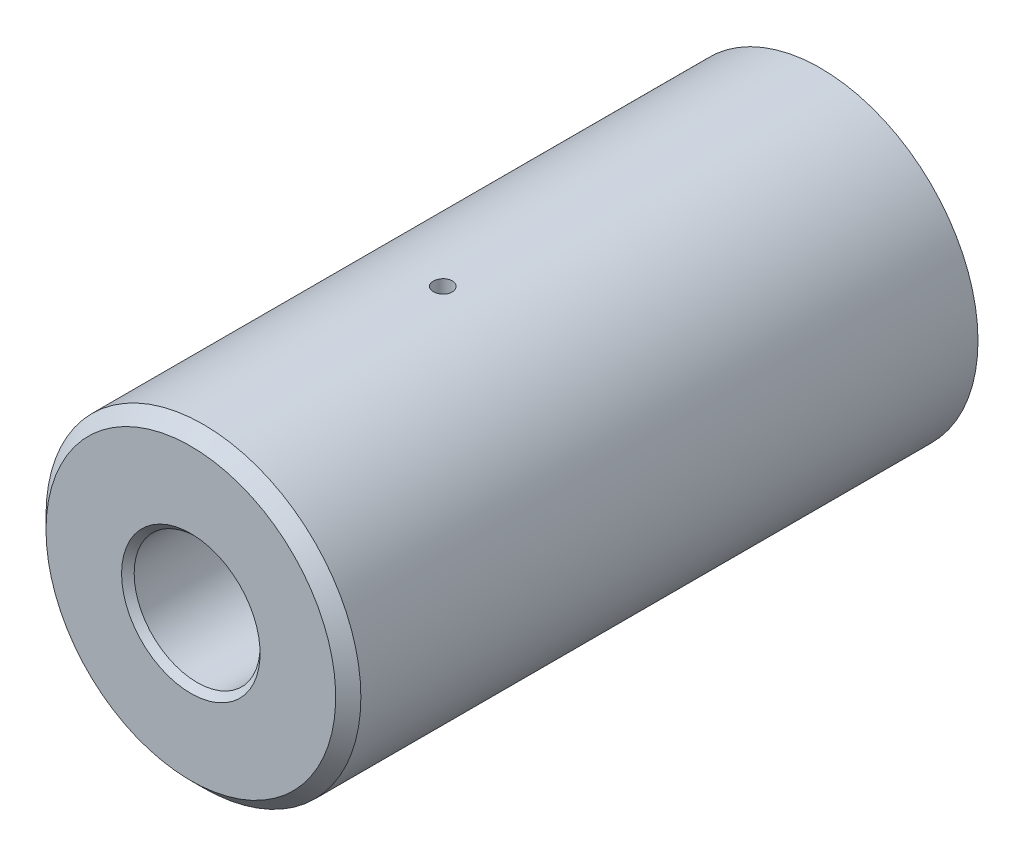
ISO-10303-21;
HEADER;
FILE_DESCRIPTION(('STEP AP214'),'2;1');
FILE_NAME('part.step','',(''),(''),'','','');
FILE_SCHEMA(('AUTOMOTIVE_DESIGN { 1 0 10303 214 1 1 1 1 }'));
ENDSEC;
DATA;
#1=APPLICATION_CONTEXT('core data for automotive mechanical design processes');
#2=APPLICATION_PROTOCOL_DEFINITION('international standard','automotive_design',2000,#1);
#3=PRODUCT_CONTEXT('',#1,'mechanical');
#4=PRODUCT('Part','Part','',(#3));
#5=PRODUCT_RELATED_PRODUCT_CATEGORY('part','',(#4));
#6=PRODUCT_DEFINITION_FORMATION('','',#4);
#7=PRODUCT_DEFINITION_CONTEXT('part definition',#1,'design');
#8=PRODUCT_DEFINITION('design','',#6,#7);
#9=PRODUCT_DEFINITION_SHAPE('','',#8);
#10=(LENGTH_UNIT() NAMED_UNIT(*) SI_UNIT(.MILLI.,.METRE.));
#11=(NAMED_UNIT(*) PLANE_ANGLE_UNIT() SI_UNIT($,.RADIAN.));
#12=(NAMED_UNIT(*) SI_UNIT($,.STERADIAN.) SOLID_ANGLE_UNIT());
#13=UNCERTAINTY_MEASURE_WITH_UNIT(LENGTH_MEASURE(1.E-05),#10,'distance_accuracy_value','');
#14=(GEOMETRIC_REPRESENTATION_CONTEXT(3) GLOBAL_UNCERTAINTY_ASSIGNED_CONTEXT((#13)) GLOBAL_UNIT_ASSIGNED_CONTEXT((#10,
#11,#12)) REPRESENTATION_CONTEXT('',''));
#15=CARTESIAN_POINT('',(0.,0.,0.));
#16=DIRECTION('',(0.,0.,1.));
#17=DIRECTION('',(1.,0.,0.));
#18=AXIS2_PLACEMENT_3D('',#15,#16,#17);
#19=CARTESIAN_POINT('',(0.,0.,20.8371683277006));
#20=DIRECTION('',(0.,0.,-1.));
#21=DIRECTION('',(-1.,0.,0.));
#22=AXIS2_PLACEMENT_3D('',#19,#20,#21);
#23=PLANE('',#22);
#24=CARTESIAN_POINT('',(0.,0.,20.8371683277006));
#25=DIRECTION('',(0.,0.,-1.));
#26=DIRECTION('',(-1.,0.,0.));
#27=AXIS2_PLACEMENT_3D('',#24,#25,#26);
#28=CIRCLE('',#27,13.);
#29=CARTESIAN_POINT('',(-13.,0.,20.8371683277006));
#30=VERTEX_POINT('',#29);
#31=EDGE_CURVE('E63',#30,#30,#28,.T.);
#32=ORIENTED_EDGE('',*,*,#31,.T.);
#33=EDGE_LOOP('',(#32));
#34=FACE_BOUND('',#33,.T.);
#35=CARTESIAN_POINT('',(0.,0.,20.8371683277006));
#36=DIRECTION('',(0.,0.,1.));
#37=DIRECTION('',(1.,0.,0.));
#38=AXIS2_PLACEMENT_3D('',#35,#36,#37);
#39=CIRCLE('',#38,10.);
#40=CARTESIAN_POINT('',(10.,0.,20.8371683277006));
#41=VERTEX_POINT('',#40);
#42=EDGE_CURVE('E191',#41,#41,#39,.T.);
#43=ORIENTED_EDGE('',*,*,#42,.T.);
#44=EDGE_LOOP('',(#43));
#45=FACE_BOUND('',#44,.T.);
#46=ADVANCED_FACE('F45',(#34,#45),#23,.T.);
#47=CARTESIAN_POINT('',(0.,0.,55.3466501870873));
#48=DIRECTION('',(0.,0.,1.));
#49=DIRECTION('',(1.,0.,0.));
#50=AXIS2_PLACEMENT_3D('',#47,#48,#49);
#51=CYLINDRICAL_SURFACE('',#50,15.);
#52=CARTESIAN_POINT('',(0.,15.,4.33716832770063));
#53=CARTESIAN_POINT('',(0.0840305306873422,14.9999990328115,4.3371719665512));
#54=CARTESIAN_POINT('',(0.168116617751665,14.9992863839431,4.3442532310453));
#55=CARTESIAN_POINT('',(0.33395759774526,14.9965120139211,4.37239488313627));
#56=CARTESIAN_POINT('',(0.415709818753246,14.9944488065104,4.39347067173751));
#57=CARTESIAN_POINT('',(0.574457513180125,14.9892062184461,4.44898168859738));
#58=CARTESIAN_POINT('',(0.651455826922367,14.9860275120106,4.48340884847834));
#59=CARTESIAN_POINT('',(0.798564241440612,14.9789093609146,4.5646296895981));
#60=CARTESIAN_POINT('',(0.868675708168616,14.974970067572,4.61142091170084));
#61=CARTESIAN_POINT('',(1.00028932601112,14.9667561651199,4.71622237419404));
#62=CARTESIAN_POINT('',(1.06176321725234,14.962480523608,4.77426802680368));
#63=CARTESIAN_POINT('',(1.17411378214648,14.9540843535939,4.89985512909517));
#64=CARTESIAN_POINT('',(1.22498996562398,14.9499638322738,4.96739701776421));
#65=CARTESIAN_POINT('',(1.31480095566542,14.9423338732918,5.11023612522606));
#66=CARTESIAN_POINT('',(1.35371019818232,14.9388257506636,5.18554949384291));
#67=CARTESIAN_POINT('',(1.41831957711414,14.9328305631979,5.34168170655809));
#68=CARTESIAN_POINT('',(1.44402003988693,14.9303434731333,5.42250041457655));
#69=CARTESIAN_POINT('',(1.48139856240284,14.9266812610947,5.58706102899963));
#70=CARTESIAN_POINT('',(1.49312347950569,14.9255017559714,5.67079219297893));
#71=CARTESIAN_POINT('',(1.50236292770304,14.9245746459079,5.83904162279429));
#72=CARTESIAN_POINT('',(1.4998778323062,14.9248270033312,5.92355986788371));
#73=CARTESIAN_POINT('',(1.48080642037901,14.926731103484,6.0906612922406));
#74=CARTESIAN_POINT('',(1.46427126618683,14.9283777688598,6.17325037669366));
#75=CARTESIAN_POINT('',(1.41764871622588,14.9328770143113,6.33447527250226));
#76=CARTESIAN_POINT('',(1.38756113738362,14.9357296106774,6.41311103043816));
#77=CARTESIAN_POINT('',(1.31463134082226,14.9423251417811,6.56435870864895));
#78=CARTESIAN_POINT('',(1.27176642407997,14.9460696586224,6.63695961193459));
#79=CARTESIAN_POINT('',(1.17451504102984,14.9540257759932,6.77395615006844));
#80=CARTESIAN_POINT('',(1.12012823750476,14.9582373901918,6.83835154467326));
#81=CARTESIAN_POINT('',(1.0010911686181,14.9666757796948,6.95740641868415));
#82=CARTESIAN_POINT('',(0.936396718277046,14.970902539995,7.01202173052182));
#83=CARTESIAN_POINT('',(0.798734222605671,14.9788774361778,7.10962377706619));
#84=CARTESIAN_POINT('',(0.725766167999404,14.9826255715238,7.15261049873533));
#85=CARTESIAN_POINT('',(0.57359715853855,14.9892221350064,7.22573335816599));
#86=CARTESIAN_POINT('',(0.494395119584859,14.9920704062215,7.2558672549277));
#87=CARTESIAN_POINT('',(0.332020825994903,14.9965447116211,7.30239670276824));
#88=CARTESIAN_POINT('',(0.248848690164906,14.998170782356,7.31879266468655));
#89=CARTESIAN_POINT('',(0.0812776486378623,15.0000127750247,7.33732478930276));
#90=CARTESIAN_POINT('',(-0.00311445315823079,15.000234724016,7.33952190007936));
#91=CARTESIAN_POINT('',(-0.171065689973541,14.999259626352,7.32975403312746));
#92=CARTESIAN_POINT('',(-0.254624836230696,14.998062598867,7.31778924672769));
#93=CARTESIAN_POINT('',(-0.418362310252002,14.9943879230879,7.28008778456825));
#94=CARTESIAN_POINT('',(-0.498547273458018,14.9919129287706,7.25437964598359));
#95=CARTESIAN_POINT('',(-0.653466482075661,14.9859599829091,7.18995056664471));
#96=CARTESIAN_POINT('',(-0.728200605235664,14.9824820088788,7.15122933414152));
#97=CARTESIAN_POINT('',(-0.8703722702582,14.9748971299563,7.06172206970474));
#98=CARTESIAN_POINT('',(-0.937784489623362,14.9707881540516,7.01089599431189));
#99=CARTESIAN_POINT('',(-1.0631424349678,14.9624089930428,6.89867922608922));
#100=CARTESIAN_POINT('',(-1.12108792327375,14.9581388038946,6.83728826809514));
#101=CARTESIAN_POINT('',(-1.2260791648307,14.9499003621113,6.70541846571211));
#102=CARTESIAN_POINT('',(-1.2730849180193,14.9459332520846,6.63490769288668));
#103=CARTESIAN_POINT('',(-1.35458738811572,14.9387674869133,6.48695728748059));
#104=CARTESIAN_POINT('',(-1.38908427608081,14.9355688212606,6.40951774966802));
#105=CARTESIAN_POINT('',(-1.4445228130267,14.9303092145107,6.25004521850193));
#106=CARTESIAN_POINT('',(-1.46548826221778,14.9282462767468,6.16802056756394));
#107=CARTESIAN_POINT('',(-1.49334601069418,14.9254854792431,6.00159353075946));
#108=CARTESIAN_POINT('',(-1.50023871359926,14.9247875803528,5.91719121315711));
#109=CARTESIAN_POINT('',(-1.49974970770687,14.9248366966134,5.74880229516556));
#110=CARTESIAN_POINT('',(-1.49243083438965,14.9255773513051,5.6648155033764));
#111=CARTESIAN_POINT('',(-1.46385817944546,14.9284065583432,5.49927095194819));
#112=CARTESIAN_POINT('',(-1.44260438214322,14.9304951122058,5.41771319504165));
#113=CARTESIAN_POINT('',(-1.38678252944624,14.9357830239478,5.25934230412884));
#114=CARTESIAN_POINT('',(-1.35221631651136,14.9389822281054,5.18252851525604));
#115=CARTESIAN_POINT('',(-1.27075733236655,14.9461312775904,5.03578299019407));
#116=CARTESIAN_POINT('',(-1.22386463018311,14.9500811187143,4.96585121546968));
#117=CARTESIAN_POINT('',(-1.11884783442798,14.9583073081455,4.83453281599273));
#118=CARTESIAN_POINT('',(-1.06067692333539,14.9625849709013,4.77318371315));
#119=CARTESIAN_POINT('',(-0.934847548837653,14.9709728209317,4.66108997865114));
#120=CARTESIAN_POINT('',(-0.867186816162374,14.9750829678446,4.61034789066487));
#121=CARTESIAN_POINT('',(-0.724112151241923,14.9826834310374,4.5208081469187));
#122=CARTESIAN_POINT('',(-0.648679124020135,14.9861721604022,4.48204089128286));
#123=CARTESIAN_POINT('',(-0.492387418650816,14.9921194387484,4.41777469346483));
#124=CARTESIAN_POINT('',(-0.411534974738405,14.9945791486448,4.39226079127031));
#125=CARTESIAN_POINT('',(-0.275187392108548,14.997573206606,4.36158740207343));
#126=CARTESIAN_POINT('',(-0.220563829266754,14.9984790103775,4.35244276125159));
#127=CARTESIAN_POINT('',(-0.110634871225961,14.9996927242618,4.34023203860799));
#128=CARTESIAN_POINT('',(-0.0553294788398291,15.0000006368404,4.33716593171784));
#129=CARTESIAN_POINT('',(0.,15.,4.33716832770063));
#130=B_SPLINE_CURVE_WITH_KNOTS('',3,(#52,#53,#54,#55,#56,#57,#58,#59,#60,#61,#62,#63,#64,#65,
#66,#67,#68,#69,#70,#71,#72,#73,#74,#75,#76,#77,#78,#79,#80,#81,#82,#83,#84,#85,#86,#87,#88,#89,
#90,#91,#92,#93,#94,#95,#96,#97,#98,#99,#100,#101,#102,#103,#104,#105,#106,#107,#108,#109,#110,
#111,#112,#113,#114,#115,#116,#117,#118,#119,#120,#121,#122,#123,#124,#125,#126,#127,#128,#129),
.UNSPECIFIED.,.T.,.F.,(4,2,2,2,2,2,2,2,2,2,2,2,2,2,2,2,2,2,2,2,2,2,2,2,2,2,2,2,2,2,2,2,2,2,2,2,
2,2,4),(0.,0.251889549402709,0.504056764253226,0.756071828598299,1.00803680637417,
1.26080785293441,1.51359058831058,1.76690963208332,2.02022241663755,2.27268348067793,
2.52513790883663,2.77667696161664,3.02821941242449,3.2802114205934,3.53221080496686,
3.78532101294307,4.03843150469655,4.29158611040369,4.54473314513156,4.79679282911633,
5.04884910778712,5.30038402941454,5.55192459074197,5.80430911123044,6.05669996715341,
6.30999965412893,6.56329587713057,6.816145358895,7.06898758859373,7.3207144394093,
7.57244157339055,7.82413388044195,8.07582477808435,8.32858376141474,8.58140328955431,
8.83485946539358,9.08802892192937,9.25388500848517,9.41974041103535),.UNSPECIFIED.);
#131=CARTESIAN_POINT('',(0.,15.,4.33716832770063));
#132=VERTEX_POINT('',#131);
#133=EDGE_CURVE('E97',#132,#132,#130,.T.);
#134=ORIENTED_EDGE('',*,*,#133,.F.);
#135=EDGE_LOOP('',(#134));
#136=FACE_BOUND('',#135,.T.);
#137=CARTESIAN_POINT('',(0.,-15.,4.33716832770063));
#138=CARTESIAN_POINT('',(-0.0840305306873284,-14.9999990328115,4.3371719665512));
#139=CARTESIAN_POINT('',(-0.168116617751651,-14.9992863839431,4.3442532310453));
#140=CARTESIAN_POINT('',(-0.333957597745246,-14.9965120139211,4.37239488313627));
#141=CARTESIAN_POINT('',(-0.415709818753232,-14.9944488065104,4.39347067173751));
#142=CARTESIAN_POINT('',(-0.574457513180111,-14.9892062184461,4.44898168859738));
#143=CARTESIAN_POINT('',(-0.651455826922353,-14.9860275120106,4.48340884847834));
#144=CARTESIAN_POINT('',(-0.798564241440598,-14.9789093609146,4.5646296895981));
#145=CARTESIAN_POINT('',(-0.868675708168602,-14.974970067572,4.61142091170084));
#146=CARTESIAN_POINT('',(-1.00028932601111,-14.9667561651199,4.71622237419404));
#147=CARTESIAN_POINT('',(-1.06176321725233,-14.962480523608,4.77426802680368));
#148=CARTESIAN_POINT('',(-1.17411378214646,-14.9540843535939,4.89985512909517));
#149=CARTESIAN_POINT('',(-1.22498996562396,-14.9499638322738,4.96739701776421));
#150=CARTESIAN_POINT('',(-1.31480095566541,-14.9423338732918,5.11023612522606));
#151=CARTESIAN_POINT('',(-1.3537101981823,-14.9388257506636,5.18554949384291));
#152=CARTESIAN_POINT('',(-1.41831957711412,-14.9328305631979,5.34168170655809));
#153=CARTESIAN_POINT('',(-1.44402003988692,-14.9303434731333,5.42250041457655));
#154=CARTESIAN_POINT('',(-1.48139856240282,-14.9266812610947,5.58706102899964));
#155=CARTESIAN_POINT('',(-1.49312347950568,-14.9255017559714,5.67079219297893));
#156=CARTESIAN_POINT('',(-1.50236292770302,-14.9245746459079,5.83904162279429));
#157=CARTESIAN_POINT('',(-1.49987783230619,-14.9248270033312,5.92355986788371));
#158=CARTESIAN_POINT('',(-1.480806420379,-14.926731103484,6.0906612922406));
#159=CARTESIAN_POINT('',(-1.46427126618681,-14.9283777688598,6.17325037669366));
#160=CARTESIAN_POINT('',(-1.41764871622586,-14.9328770143113,6.33447527250226));
#161=CARTESIAN_POINT('',(-1.3875611373836,-14.9357296106774,6.41311103043816));
#162=CARTESIAN_POINT('',(-1.31463134082225,-14.9423251417811,6.56435870864895));
#163=CARTESIAN_POINT('',(-1.27176642407995,-14.9460696586224,6.63695961193459));
#164=CARTESIAN_POINT('',(-1.17451504102983,-14.9540257759932,6.77395615006844));
#165=CARTESIAN_POINT('',(-1.12012823750474,-14.9582373901918,6.83835154467326));
#166=CARTESIAN_POINT('',(-1.00109116861809,-14.9666757796948,6.95740641868415));
#167=CARTESIAN_POINT('',(-0.936396718277032,-14.970902539995,7.01202173052182));
#168=CARTESIAN_POINT('',(-0.798734222605656,-14.9788774361778,7.10962377706619));
#169=CARTESIAN_POINT('',(-0.725766167999389,-14.9826255715238,7.15261049873533));
#170=CARTESIAN_POINT('',(-0.573597158538536,-14.9892221350064,7.22573335816599));
#171=CARTESIAN_POINT('',(-0.494395119584845,-14.9920704062215,7.2558672549277));
#172=CARTESIAN_POINT('',(-0.332020825994889,-14.9965447116211,7.30239670276824));
#173=CARTESIAN_POINT('',(-0.248848690164892,-14.998170782356,7.31879266468655));
#174=CARTESIAN_POINT('',(-0.0812776486378481,-15.0000127750247,7.33732478930276));
#175=CARTESIAN_POINT('',(0.00311445315824476,-15.000234724016,7.33952190007936));
#176=CARTESIAN_POINT('',(0.171065689973555,-14.999259626352,7.32975403312747));
#177=CARTESIAN_POINT('',(0.25462483623071,-14.998062598867,7.31778924672769));
#178=CARTESIAN_POINT('',(0.418362310252016,-14.9943879230879,7.28008778456825));
#179=CARTESIAN_POINT('',(0.498547273458032,-14.9919129287706,7.25437964598359));
#180=CARTESIAN_POINT('',(0.653466482075675,-14.9859599829091,7.1899505666447));
#181=CARTESIAN_POINT('',(0.728200605235678,-14.9824820088788,7.15122933414152));
#182=CARTESIAN_POINT('',(0.870372270258215,-14.9748971299563,7.06172206970474));
#183=CARTESIAN_POINT('',(0.937784489623377,-14.9707881540516,7.01089599431189));
#184=CARTESIAN_POINT('',(1.06314243496782,-14.9624089930428,6.89867922608922));
#185=CARTESIAN_POINT('',(1.12108792327377,-14.9581388038946,6.83728826809514));
#186=CARTESIAN_POINT('',(1.22607916483072,-14.9499003621113,6.70541846571211));
#187=CARTESIAN_POINT('',(1.27308491801931,-14.9459332520846,6.63490769288668));
#188=CARTESIAN_POINT('',(1.35458738811574,-14.9387674869133,6.48695728748059));
#189=CARTESIAN_POINT('',(1.38908427608082,-14.9355688212606,6.40951774966802));
#190=CARTESIAN_POINT('',(1.44452281302671,-14.9303092145107,6.25004521850193));
#191=CARTESIAN_POINT('',(1.46548826221779,-14.9282462767468,6.16802056756394));
#192=CARTESIAN_POINT('',(1.49334601069419,-14.9254854792431,6.00159353075946));
#193=CARTESIAN_POINT('',(1.50023871359927,-14.9247875803528,5.91719121315711));
#194=CARTESIAN_POINT('',(1.49974970770688,-14.9248366966134,5.74880229516556));
#195=CARTESIAN_POINT('',(1.49243083438967,-14.9255773513051,5.6648155033764));
#196=CARTESIAN_POINT('',(1.46385817944548,-14.9284065583432,5.49927095194819));
#197=CARTESIAN_POINT('',(1.44260438214324,-14.9304951122058,5.41771319504165));
#198=CARTESIAN_POINT('',(1.38678252944625,-14.9357830239478,5.25934230412884));
#199=CARTESIAN_POINT('',(1.35221631651137,-14.9389822281054,5.18252851525604));
#200=CARTESIAN_POINT('',(1.27075733236656,-14.9461312775904,5.03578299019407));
#201=CARTESIAN_POINT('',(1.22386463018312,-14.9500811187143,4.96585121546968));
#202=CARTESIAN_POINT('',(1.118847834428,-14.9583073081455,4.83453281599272));
#203=CARTESIAN_POINT('',(1.0606769233354,-14.9625849709013,4.77318371315));
#204=CARTESIAN_POINT('',(0.934847548837664,-14.9709728209317,4.66108997865114));
#205=CARTESIAN_POINT('',(0.867186816162386,-14.9750829678446,4.61034789066487));
#206=CARTESIAN_POINT('',(0.724112151241935,-14.9826834310374,4.5208081469187));
#207=CARTESIAN_POINT('',(0.648679124020147,-14.9861721604022,4.48204089128285));
#208=CARTESIAN_POINT('',(0.492387418650829,-14.9921194387484,4.41777469346483));
#209=CARTESIAN_POINT('',(0.411534974738418,-14.9945791486448,4.39226079127031));
#210=CARTESIAN_POINT('',(0.275187392108561,-14.997573206606,4.36158740207343));
#211=CARTESIAN_POINT('',(0.220563829266769,-14.9984790103775,4.35244276125159));
#212=CARTESIAN_POINT('',(0.110634871225975,-14.9996927242618,4.34023203860799));
#213=CARTESIAN_POINT('',(0.0553294788398433,-15.0000006368404,4.33716593171784));
#214=CARTESIAN_POINT('',(0.,-15.,4.33716832770063));
#215=B_SPLINE_CURVE_WITH_KNOTS('',3,(#137,#138,#139,#140,#141,#142,#143,#144,#145,#146,#147,
#148,#149,#150,#151,#152,#153,#154,#155,#156,#157,#158,#159,#160,#161,#162,#163,#164,#165,#166,
#167,#168,#169,#170,#171,#172,#173,#174,#175,#176,#177,#178,#179,#180,#181,#182,#183,#184,#185,
#186,#187,#188,#189,#190,#191,#192,#193,#194,#195,#196,#197,#198,#199,#200,#201,#202,#203,#204,
#205,#206,#207,#208,#209,#210,#211,#212,#213,#214),.UNSPECIFIED.,.T.,.F.,(4,2,2,2,2,2,2,2,2,2,2,
2,2,2,2,2,2,2,2,2,2,2,2,2,2,2,2,2,2,2,2,2,2,2,2,2,2,2,4),(0.,0.251889549402709,
0.504056764253226,0.756071828598299,1.00803680637417,1.26080785293441,1.51359058831058,
1.76690963208332,2.02022241663755,2.27268348067793,2.52513790883663,2.77667696161664,
3.02821941242449,3.2802114205934,3.53221080496686,3.78532101294307,4.03843150469655,
4.29158611040369,4.54473314513156,4.79679282911633,5.04884910778712,5.30038402941454,
5.55192459074197,5.80430911123044,6.05669996715341,6.30999965412894,6.56329587713057,
6.816145358895,7.06898758859373,7.3207144394093,7.57244157339055,7.82413388044195,
8.07582477808435,8.32858376141475,8.58140328955431,8.83485946539358,9.08802892192937,
9.25388500848517,9.41974041103535),.UNSPECIFIED.);
#216=CARTESIAN_POINT('',(0.,-15.,4.33716832770063));
#217=VERTEX_POINT('',#216);
#218=EDGE_CURVE('E90',#217,#217,#215,.T.);
#219=ORIENTED_EDGE('',*,*,#218,.F.);
#220=EDGE_LOOP('',(#219));
#221=FACE_BOUND('',#220,.T.);
#222=CARTESIAN_POINT('',(0.,0.,18.8371683277006));
#223=DIRECTION('',(0.,0.,-1.));
#224=DIRECTION('',(-1.,0.,0.));
#225=AXIS2_PLACEMENT_3D('',#222,#223,#224);
#226=CIRCLE('',#225,15.);
#227=CARTESIAN_POINT('',(-15.,0.,18.8371683277006));
#228=VERTEX_POINT('',#227);
#229=EDGE_CURVE('E68',#228,#228,#226,.F.);
#230=ORIENTED_EDGE('',*,*,#229,.T.);
#231=EDGE_LOOP('',(#230));
#232=FACE_BOUND('',#231,.T.);
#233=CARTESIAN_POINT('',(0.,0.,-14.1628316722994));
#234=DIRECTION('',(0.,0.,1.));
#235=DIRECTION('',(1.,0.,0.));
#236=AXIS2_PLACEMENT_3D('',#233,#234,#235);
#237=CIRCLE('',#236,15.);
#238=CARTESIAN_POINT('',(15.,0.,-14.1628316722994));
#239=VERTEX_POINT('',#238);
#240=EDGE_CURVE('E163',#239,#239,#237,.T.);
#241=ORIENTED_EDGE('',*,*,#240,.F.);
#242=EDGE_LOOP('',(#241));
#243=FACE_BOUND('',#242,.T.);
#244=ADVANCED_FACE('F102',(#136,#221,#232,#243),#51,.F.);
#245=CARTESIAN_POINT('',(0.,0.,-14.1628316722994));
#246=DIRECTION('',(0.,0.,1.));
#247=DIRECTION('',(1.,0.,0.));
#248=AXIS2_PLACEMENT_3D('',#245,#246,#247);
#249=PLANE('',#248);
#250=CARTESIAN_POINT('',(0.,0.,-14.1628316722994));
#251=DIRECTION('',(0.,0.,1.));
#252=DIRECTION('',(1.,0.,0.));
#253=AXIS2_PLACEMENT_3D('',#250,#251,#252);
#254=CIRCLE('',#253,18.);
#255=CARTESIAN_POINT('',(18.,0.,-14.1628316722994));
#256=VERTEX_POINT('',#255);
#257=EDGE_CURVE('E167',#256,#256,#254,.T.);
#258=ORIENTED_EDGE('',*,*,#257,.F.);
#259=EDGE_LOOP('',(#258));
#260=FACE_BOUND('',#259,.T.);
#261=ORIENTED_EDGE('',*,*,#240,.T.);
#262=EDGE_LOOP('',(#261));
#263=FACE_BOUND('',#262,.T.);
#264=ADVANCED_FACE('F107',(#260,#263),#249,.F.);
#265=CARTESIAN_POINT('',(0.,0.,55.3466501870873));
#266=DIRECTION('',(0.,0.,1.));
#267=DIRECTION('',(1.,0.,0.));
#268=AXIS2_PLACEMENT_3D('',#265,#266,#267);
#269=CYLINDRICAL_SURFACE('',#268,18.);
#270=CARTESIAN_POINT('',(0.,0.,-19.1628316722994));
#271=DIRECTION('',(0.,0.,1.));
#272=DIRECTION('',(1.,0.,0.));
#273=AXIS2_PLACEMENT_3D('',#270,#271,#272);
#274=CIRCLE('',#273,18.);
#275=CARTESIAN_POINT('',(18.,0.,-19.1628316722994));
#276=VERTEX_POINT('',#275);
#277=EDGE_CURVE('E175',#276,#276,#274,.T.);
#278=ORIENTED_EDGE('',*,*,#277,.F.);
#279=EDGE_LOOP('',(#278));
#280=FACE_BOUND('',#279,.T.);
#281=ORIENTED_EDGE('',*,*,#257,.T.);
#282=EDGE_LOOP('',(#281));
#283=FACE_BOUND('',#282,.T.);
#284=ADVANCED_FACE('F210',(#280,#283),#269,.F.);
#285=CARTESIAN_POINT('',(0.,0.,-19.1628316722994));
#286=DIRECTION('',(0.,0.,-1.));
#287=DIRECTION('',(-1.,0.,0.));
#288=AXIS2_PLACEMENT_3D('',#285,#286,#287);
#289=PLANE('',#288);
#290=CARTESIAN_POINT('',(0.,0.,-19.1628316722994));
#291=DIRECTION('',(0.,0.,1.));
#292=DIRECTION('',(1.,0.,0.));
#293=AXIS2_PLACEMENT_3D('',#290,#291,#292);
#294=CIRCLE('',#293,15.);
#295=CARTESIAN_POINT('',(15.,0.,-19.1628316722994));
#296=VERTEX_POINT('',#295);
#297=EDGE_CURVE('E198',#296,#296,#294,.T.);
#298=ORIENTED_EDGE('',*,*,#297,.F.);
#299=EDGE_LOOP('',(#298));
#300=FACE_BOUND('',#299,.T.);
#301=ORIENTED_EDGE('',*,*,#277,.T.);
#302=EDGE_LOOP('',(#301));
#303=FACE_BOUND('',#302,.T.);
#304=ADVANCED_FACE('F208',(#300,#303),#289,.F.);
#305=CARTESIAN_POINT('',(0.,0.,55.3466501870873));
#306=DIRECTION('',(0.,0.,1.));
#307=DIRECTION('',(1.,0.,0.));
#308=AXIS2_PLACEMENT_3D('',#305,#306,#307);
#309=CYLINDRICAL_SURFACE('',#308,15.);
#310=CARTESIAN_POINT('',(0.,0.,-53.1628316722994));
#311=DIRECTION('',(0.,0.,1.));
#312=DIRECTION('',(1.,0.,0.));
#313=AXIS2_PLACEMENT_3D('',#310,#311,#312);
#314=CIRCLE('',#313,15.);
#315=CARTESIAN_POINT('',(15.,0.,-53.1628316722994));
#316=VERTEX_POINT('',#315);
#317=EDGE_CURVE('E172',#316,#316,#314,.F.);
#318=ORIENTED_EDGE('',*,*,#317,.T.);
#319=EDGE_LOOP('',(#318));
#320=FACE_BOUND('',#319,.T.);
#321=ORIENTED_EDGE('',*,*,#297,.T.);
#322=EDGE_LOOP('',(#321));
#323=FACE_BOUND('',#322,.T.);
#324=ADVANCED_FACE('F230',(#320,#323),#309,.F.);
#325=CARTESIAN_POINT('',(0.,0.,-54.1628316722994));
#326=DIRECTION('',(0.,0.,1.));
#327=DIRECTION('',(1.,0.,0.));
#328=AXIS2_PLACEMENT_3D('',#325,#326,#327);
#329=PLANE('',#328);
#330=CARTESIAN_POINT('',(0.,0.,-54.1628316722994));
#331=DIRECTION('',(0.,0.,1.));
#332=DIRECTION('',(1.,0.,0.));
#333=AXIS2_PLACEMENT_3D('',#330,#331,#332);
#334=CIRCLE('',#333,16.);
#335=CARTESIAN_POINT('',(16.,0.,-54.1628316722994));
#336=VERTEX_POINT('',#335);
#337=EDGE_CURVE('E166',#336,#336,#334,.T.);
#338=ORIENTED_EDGE('',*,*,#337,.T.);
#339=EDGE_LOOP('',(#338));
#340=FACE_BOUND('',#339,.T.);
#341=CARTESIAN_POINT('',(0.,0.,-54.1628316722994));
#342=DIRECTION('',(0.,0.,1.));
#343=DIRECTION('',(1.,0.,0.));
#344=AXIS2_PLACEMENT_3D('',#341,#342,#343);
#345=CIRCLE('',#344,25.);
#346=CARTESIAN_POINT('',(25.,0.,-54.1628316722994));
#347=VERTEX_POINT('',#346);
#348=EDGE_CURVE('E194',#347,#347,#345,.T.);
#349=ORIENTED_EDGE('',*,*,#348,.F.);
#350=EDGE_LOOP('',(#349));
#351=FACE_BOUND('',#350,.T.);
#352=ADVANCED_FACE('F238',(#340,#351),#329,.F.);
#353=CARTESIAN_POINT('',(0.,0.,55.3466501870873));
#354=DIRECTION('',(0.,0.,1.));
#355=DIRECTION('',(1.,0.,0.));
#356=AXIS2_PLACEMENT_3D('',#353,#354,#355);
#357=CYLINDRICAL_SURFACE('',#356,25.);
#358=CARTESIAN_POINT('',(0.,25.,4.33716832770063));
#359=CARTESIAN_POINT('',(-0.0841744112906918,24.9999994009396,4.33717203388265));
#360=CARTESIAN_POINT('',(-0.168407925575413,24.9995703322505,4.34427746540683));
#361=CARTESIAN_POINT('',(-0.334549549235275,24.9978999420123,4.37252071927045));
#362=CARTESIAN_POINT('',(-0.416454828330703,24.9966576725644,4.3936749178223));
#363=CARTESIAN_POINT('',(-0.575509331027293,24.9935014300757,4.44940634258445));
#364=CARTESIAN_POINT('',(-0.652661020509556,24.9915878088006,4.48397654026749));
#365=CARTESIAN_POINT('',(-0.800046136146092,24.9873041548427,4.56554737575616));
#366=CARTESIAN_POINT('',(-0.870281152186763,24.9849342274195,4.61254514772784));
#367=CARTESIAN_POINT('',(-1.00195727834144,24.9800007098428,4.71770890057312));
#368=CARTESIAN_POINT('',(-1.0633875072824,24.9774368859408,4.7758884959731));
#369=CARTESIAN_POINT('',(-1.17561728443768,24.9724065327507,4.90173647701667));
#370=CARTESIAN_POINT('',(-1.22641639063193,24.9699400075116,4.96940525700563));
#371=CARTESIAN_POINT('',(-1.31597486784902,24.9653806252969,5.11237160596279));
#372=CARTESIAN_POINT('',(-1.35472528905778,24.9632880465787,5.1876747910047));
#373=CARTESIAN_POINT('',(-1.41902912258916,24.9597155336563,5.3437329672765));
#374=CARTESIAN_POINT('',(-1.4445826677171,24.9582355932868,5.42448790363404));
#375=CARTESIAN_POINT('',(-1.48173741565117,24.9560574575134,5.58905318563545));
#376=CARTESIAN_POINT('',(-1.49335553999937,24.9553583140724,5.67285969806635));
#377=CARTESIAN_POINT('',(-1.50236188160071,24.954817773996,5.84123610759851));
#378=CARTESIAN_POINT('',(-1.4997502493664,24.954976368288,5.92580599661586));
#379=CARTESIAN_POINT('',(-1.48038526467144,24.9561325386846,6.09319329028019));
#380=CARTESIAN_POINT('',(-1.46365021721637,24.9571290288072,6.1760128211702));
#381=CARTESIAN_POINT('',(-1.41654183568935,24.9598469788447,6.33766508686893));
#382=CARTESIAN_POINT('',(-1.38616842513185,24.9615684428253,6.41649779931633));
#383=CARTESIAN_POINT('',(-1.31262469930023,24.9655435872457,6.56799750090421));
#384=CARTESIAN_POINT('',(-1.26944607125187,24.9677976132153,6.64066044527422));
#385=CARTESIAN_POINT('',(-1.17152362364146,24.9725835122349,6.77771375233059));
#386=CARTESIAN_POINT('',(-1.11677968459201,24.9751153881552,6.84210402953657));
#387=CARTESIAN_POINT('',(-0.997177453913955,24.9801764756538,6.9608907087794));
#388=CARTESIAN_POINT('',(-0.932303318346449,24.9827056767018,7.01527115982692));
#389=CARTESIAN_POINT('',(-0.79433780707834,24.9874725341813,7.11237151480464));
#390=CARTESIAN_POINT('',(-0.721246428711375,24.9897101905182,7.15509141495115));
#391=CARTESIAN_POINT('',(-0.568911628096262,24.9936419598513,7.22765661770795));
#392=CARTESIAN_POINT('',(-0.489667922304722,24.9953360477775,7.25750132652093));
#393=CARTESIAN_POINT('',(-0.32728218658415,24.9979894319355,7.30345835927242));
#394=CARTESIAN_POINT('',(-0.244140198631611,24.9989487360774,7.31957083104311));
#395=CARTESIAN_POINT('',(-0.0764564081212602,25.0000234317371,7.33758627366301));
#396=CARTESIAN_POINT('',(0.00808301680838586,25.000140133157,7.33951130027604));
#397=CARTESIAN_POINT('',(0.176283598525675,24.9995199551995,7.32915482115773));
#398=CARTESIAN_POINT('',(0.259944759518499,24.998783079911,7.31687338347914));
#399=CARTESIAN_POINT('',(0.423951918612626,24.9965395546253,7.2784708613062));
#400=CARTESIAN_POINT('',(0.504300292000617,24.9950334669082,7.25235988543433));
#401=CARTESIAN_POINT('',(0.659474362375065,24.991420983828,7.187049744381));
#402=CARTESIAN_POINT('',(0.734300013552598,24.9893145834861,7.14785047065189));
#403=CARTESIAN_POINT('',(0.876405673907387,24.9847349543981,7.05742024140011));
#404=CARTESIAN_POINT('',(0.943676287014676,24.9822612775589,7.00617454354746));
#405=CARTESIAN_POINT('',(1.06866774190153,24.9772270256052,6.89312761929145));
#406=CARTESIAN_POINT('',(1.12638849680831,24.9746664497003,6.83132629687649));
#407=CARTESIAN_POINT('',(1.23071636822773,24.9697432142549,6.69882733940137));
#408=CARTESIAN_POINT('',(1.27730918435509,24.9673808118859,6.6281184335572));
#409=CARTESIAN_POINT('',(1.35796077823128,24.9631244152043,6.47986818759275));
#410=CARTESIAN_POINT('',(1.3920196283509,24.9612304181871,6.40232688692573));
#411=CARTESIAN_POINT('',(1.44661168369628,24.9581262710517,6.2426653600867));
#412=CARTESIAN_POINT('',(1.46715391475467,24.9569156646707,6.16054822928707));
#413=CARTESIAN_POINT('',(1.49415910044394,24.9553135506001,5.99402297924227));
#414=CARTESIAN_POINT('',(1.50062218175197,24.9549220355407,5.909614880617));
#415=CARTESIAN_POINT('',(1.49928439559964,24.9550024337275,5.7410459528562));
#416=CARTESIAN_POINT('',(1.4915060131671,24.955472985906,5.65688494370278));
#417=CARTESIAN_POINT('',(1.46195268745905,24.9572216088909,5.49106620306835));
#418=CARTESIAN_POINT('',(1.44017771850782,24.9584996811785,5.40940847617973));
#419=CARTESIAN_POINT('',(1.38325430313316,24.9617189844004,5.25091061567962));
#420=CARTESIAN_POINT('',(1.34810590374647,24.9636602130021,5.17407046512496));
#421=CARTESIAN_POINT('',(1.26543658450865,24.9679870227359,5.02737934394703));
#422=CARTESIAN_POINT('',(1.21791599798011,24.9703725918963,4.95752818510153));
#423=CARTESIAN_POINT('',(1.11176851558594,24.9753236195898,4.82668411370333));
#424=CARTESIAN_POINT('',(1.05312545630152,24.9778893364568,4.76570432398948));
#425=CARTESIAN_POINT('',(0.926417671082017,24.9829093861692,4.6544342463462));
#426=CARTESIAN_POINT('',(0.858350640782176,24.9853636915766,4.60414658052168));
#427=CARTESIAN_POINT('',(0.71465486813535,24.9898867196811,4.51565417067462));
#428=CARTESIAN_POINT('',(0.639017327934048,24.9919549855695,4.47746370475208));
#429=CARTESIAN_POINT('',(0.482446674586148,24.9954666177913,4.41437074599106));
#430=CARTESIAN_POINT('',(0.401519900921804,24.9969107169712,4.3894526617503));
#431=CARTESIAN_POINT('',(0.266746945425291,24.9986320978355,4.36010119843798));
#432=CARTESIAN_POINT('',(0.213772324734729,24.9991427869583,4.35151246144211));
#433=CARTESIAN_POINT('',(0.107206461740477,24.9998269286143,4.34004484934901));
#434=CARTESIAN_POINT('',(0.0536152202163922,25.0000003815739,4.33716596703351));
#435=CARTESIAN_POINT('',(0.,25.,4.33716832770063));
#436=B_SPLINE_CURVE_WITH_KNOTS('',3,(#358,#359,#360,#361,#362,#363,#364,#365,#366,#367,#368,
#369,#370,#371,#372,#373,#374,#375,#376,#377,#378,#379,#380,#381,#382,#383,#384,#385,#386,#387,
#388,#389,#390,#391,#392,#393,#394,#395,#396,#397,#398,#399,#400,#401,#402,#403,#404,#405,#406,
#407,#408,#409,#410,#411,#412,#413,#414,#415,#416,#417,#418,#419,#420,#421,#422,#423,#424,#425,
#426,#427,#428,#429,#430,#431,#432,#433,#434,#435),.UNSPECIFIED.,.T.,.F.,(4,2,2,2,2,2,2,2,2,2,2,
2,2,2,2,2,2,2,2,2,2,2,2,2,2,2,2,2,2,2,2,2,2,2,2,2,2,2,4),(0.,0.252327509077058,
0.504949665992944,0.757439654594842,1.00987146898755,1.26261260362567,1.5153642446301,
1.76830318456219,2.02123957902124,2.27386852521718,2.52649479928367,2.77879415269301,
3.03109492104442,3.2835598355736,3.53602735857987,3.78889377835759,4.04176028018659,
4.29463844284422,4.54751388314836,4.7999961208907,5.05247714918091,5.30477388207094,
5.55707270743324,5.80968191670635,6.06229342377877,6.31522783298443,6.56816078173089,
6.82092466056897,7.07368626515451,7.32604914306339,7.57841248391492,7.83077493716769,
8.08313059215596,8.33585582543012,8.58864296499106,8.84172736228346,9.09451379555064,
9.255234991707,9.41595598468309),.UNSPECIFIED.);
#437=CARTESIAN_POINT('',(0.,25.,4.33716832770063));
#438=VERTEX_POINT('',#437);
#439=EDGE_CURVE('E10',#438,#438,#436,.T.);
#440=ORIENTED_EDGE('',*,*,#439,.F.);
#441=EDGE_LOOP('',(#440));
#442=FACE_BOUND('',#441,.T.);
#443=CARTESIAN_POINT('',(0.,-25.,4.33716832770063));
#444=CARTESIAN_POINT('',(0.0841744112906987,-24.9999994009396,4.33717203388265));
#445=CARTESIAN_POINT('',(0.16840792557542,-24.9995703322505,4.34427746540683));
#446=CARTESIAN_POINT('',(0.334549549235282,-24.9978999420123,4.37252071927045));
#447=CARTESIAN_POINT('',(0.41645482833071,-24.9966576725644,4.3936749178223));
#448=CARTESIAN_POINT('',(0.575509331027301,-24.9935014300757,4.44940634258445));
#449=CARTESIAN_POINT('',(0.652661020509564,-24.9915878088006,4.48397654026749));
#450=CARTESIAN_POINT('',(0.8000461361461,-24.9873041548427,4.56554737575616));
#451=CARTESIAN_POINT('',(0.870281152186772,-24.9849342274195,4.61254514772784));
#452=CARTESIAN_POINT('',(1.00195727834145,-24.9800007098428,4.71770890057312));
#453=CARTESIAN_POINT('',(1.06338750728241,-24.9774368859408,4.7758884959731));
#454=CARTESIAN_POINT('',(1.17561728443769,-24.9724065327507,4.90173647701666));
#455=CARTESIAN_POINT('',(1.22641639063194,-24.9699400075116,4.96940525700563));
#456=CARTESIAN_POINT('',(1.31597486784903,-24.9653806252969,5.11237160596279));
#457=CARTESIAN_POINT('',(1.35472528905779,-24.9632880465787,5.18767479100469));
#458=CARTESIAN_POINT('',(1.41902912258917,-24.9597155336563,5.3437329672765));
#459=CARTESIAN_POINT('',(1.44458266771711,-24.9582355932868,5.42448790363404));
#460=CARTESIAN_POINT('',(1.48173741565118,-24.9560574575134,5.58905318563545));
#461=CARTESIAN_POINT('',(1.49335553999938,-24.9553583140724,5.67285969806634));
#462=CARTESIAN_POINT('',(1.50236188160072,-24.954817773996,5.8412361075985));
#463=CARTESIAN_POINT('',(1.49975024936642,-24.954976368288,5.92580599661585));
#464=CARTESIAN_POINT('',(1.48038526467146,-24.9561325386846,6.09319329028019));
#465=CARTESIAN_POINT('',(1.46365021721639,-24.9571290288072,6.1760128211702));
#466=CARTESIAN_POINT('',(1.41654183568936,-24.9598469788447,6.33766508686892));
#467=CARTESIAN_POINT('',(1.38616842513186,-24.9615684428253,6.41649779931632));
#468=CARTESIAN_POINT('',(1.31262469930025,-24.9655435872457,6.56799750090421));
#469=CARTESIAN_POINT('',(1.26944607125189,-24.9677976132153,6.64066044527421));
#470=CARTESIAN_POINT('',(1.17152362364147,-24.9725835122349,6.77771375233059));
#471=CARTESIAN_POINT('',(1.11677968459203,-24.9751153881552,6.84210402953657));
#472=CARTESIAN_POINT('',(0.997177453913974,-24.9801764756538,6.96089070877939));
#473=CARTESIAN_POINT('',(0.932303318346468,-24.9827056767018,7.01527115982692));
#474=CARTESIAN_POINT('',(0.794337807078359,-24.9874725341813,7.11237151480463));
#475=CARTESIAN_POINT('',(0.721246428711394,-24.9897101905182,7.15509141495115));
#476=CARTESIAN_POINT('',(0.568911628096282,-24.9936419598513,7.22765661770795));
#477=CARTESIAN_POINT('',(0.489667922304742,-24.9953360477775,7.25750132652093));
#478=CARTESIAN_POINT('',(0.32728218658417,-24.9979894319355,7.30345835927242));
#479=CARTESIAN_POINT('',(0.244140198631632,-24.9989487360774,7.31957083104311));
#480=CARTESIAN_POINT('',(0.0764564081212812,-25.0000234317371,7.33758627366301));
#481=CARTESIAN_POINT('',(-0.00808301680836485,-25.000140133157,7.33951130027604));
#482=CARTESIAN_POINT('',(-0.176283598525654,-24.9995199551995,7.32915482115773));
#483=CARTESIAN_POINT('',(-0.259944759518478,-24.998783079911,7.31687338347914));
#484=CARTESIAN_POINT('',(-0.423951918612605,-24.9965395546253,7.2784708613062));
#485=CARTESIAN_POINT('',(-0.504300292000597,-24.9950334669082,7.25235988543433));
#486=CARTESIAN_POINT('',(-0.659474362375045,-24.991420983828,7.18704974438101));
#487=CARTESIAN_POINT('',(-0.734300013552579,-24.9893145834861,7.14785047065189));
#488=CARTESIAN_POINT('',(-0.876405673907368,-24.9847349543981,7.05742024140011));
#489=CARTESIAN_POINT('',(-0.943676287014658,-24.982261277559,7.00617454354747));
#490=CARTESIAN_POINT('',(-1.06866774190151,-24.9772270256052,6.89312761929146));
#491=CARTESIAN_POINT('',(-1.1263884968083,-24.9746664497003,6.83132629687649));
#492=CARTESIAN_POINT('',(-1.23071636822771,-24.9697432142549,6.69882733940138));
#493=CARTESIAN_POINT('',(-1.27730918435507,-24.9673808118859,6.6281184335572));
#494=CARTESIAN_POINT('',(-1.35796077823127,-24.9631244152043,6.47986818759275));
#495=CARTESIAN_POINT('',(-1.39201962835088,-24.9612304181871,6.40232688692574));
#496=CARTESIAN_POINT('',(-1.44661168369626,-24.9581262710517,6.2426653600867));
#497=CARTESIAN_POINT('',(-1.46715391475465,-24.9569156646707,6.16054822928707));
#498=CARTESIAN_POINT('',(-1.49415910044392,-24.9553135506001,5.99402297924227));
#499=CARTESIAN_POINT('',(-1.50062218175196,-24.9549220355407,5.90961488061701));
#500=CARTESIAN_POINT('',(-1.49928439559962,-24.9550024337275,5.74104595285621));
#501=CARTESIAN_POINT('',(-1.49150601316709,-24.955472985906,5.65688494370278));
#502=CARTESIAN_POINT('',(-1.46195268745904,-24.9572216088909,5.49106620306836));
#503=CARTESIAN_POINT('',(-1.44017771850781,-24.9584996811785,5.40940847617974));
#504=CARTESIAN_POINT('',(-1.38325430313315,-24.9617189844004,5.25091061567963));
#505=CARTESIAN_POINT('',(-1.34810590374646,-24.9636602130021,5.17407046512497));
#506=CARTESIAN_POINT('',(-1.26543658450865,-24.9679870227359,5.02737934394703));
#507=CARTESIAN_POINT('',(-1.2179159979801,-24.9703725918963,4.95752818510153));
#508=CARTESIAN_POINT('',(-1.11176851558593,-24.9753236195898,4.82668411370334));
#509=CARTESIAN_POINT('',(-1.05312545630151,-24.9778893364568,4.76570432398948));
#510=CARTESIAN_POINT('',(-0.92641767108201,-24.9829093861692,4.6544342463462));
#511=CARTESIAN_POINT('',(-0.858350640782169,-24.9853636915766,4.60414658052168));
#512=CARTESIAN_POINT('',(-0.714654868135342,-24.9898867196811,4.51565417067462));
#513=CARTESIAN_POINT('',(-0.63901732793404,-24.9919549855695,4.47746370475208));
#514=CARTESIAN_POINT('',(-0.482446674586141,-24.9954666177913,4.41437074599106));
#515=CARTESIAN_POINT('',(-0.401519900921797,-24.9969107169712,4.38945266175031));
#516=CARTESIAN_POINT('',(-0.266746945425284,-24.9986320978355,4.36010119843798));
#517=CARTESIAN_POINT('',(-0.213772324734722,-24.9991427869583,4.35151246144211));
#518=CARTESIAN_POINT('',(-0.107206461740471,-24.9998269286143,4.34004484934901));
#519=CARTESIAN_POINT('',(-0.0536152202163853,-25.0000003815739,4.33716596703351));
#520=CARTESIAN_POINT('',(0.,-25.,4.33716832770063));
#521=B_SPLINE_CURVE_WITH_KNOTS('',3,(#443,#444,#445,#446,#447,#448,#449,#450,#451,#452,#453,
#454,#455,#456,#457,#458,#459,#460,#461,#462,#463,#464,#465,#466,#467,#468,#469,#470,#471,#472,
#473,#474,#475,#476,#477,#478,#479,#480,#481,#482,#483,#484,#485,#486,#487,#488,#489,#490,#491,
#492,#493,#494,#495,#496,#497,#498,#499,#500,#501,#502,#503,#504,#505,#506,#507,#508,#509,#510,
#511,#512,#513,#514,#515,#516,#517,#518,#519,#520),.UNSPECIFIED.,.T.,.F.,(4,2,2,2,2,2,2,2,2,2,2,
2,2,2,2,2,2,2,2,2,2,2,2,2,2,2,2,2,2,2,2,2,2,2,2,2,2,2,4),(0.,0.252327509077058,
0.504949665992944,0.757439654594842,1.00987146898755,1.26261260362567,1.5153642446301,
1.76830318456219,2.02123957902124,2.27386852521718,2.52649479928367,2.77879415269301,
3.03109492104442,3.2835598355736,3.53602735857987,3.78889377835759,4.04176028018659,
4.29463844284422,4.54751388314836,4.7999961208907,5.05247714918091,5.30477388207094,
5.55707270743324,5.80968191670635,6.06229342377877,6.31522783298443,6.56816078173089,
6.82092466056897,7.07368626515451,7.32604914306339,7.57841248391492,7.83077493716769,
8.08313059215596,8.33585582543012,8.58864296499106,8.84172736228346,9.09451379555064,
9.25523499170701,9.41595598468309),.UNSPECIFIED.);
#522=CARTESIAN_POINT('',(0.,-25.,4.33716832770063));
#523=VERTEX_POINT('',#522);
#524=EDGE_CURVE('E58',#523,#523,#521,.T.);
#525=ORIENTED_EDGE('',*,*,#524,.F.);
#526=EDGE_LOOP('',(#525));
#527=FACE_BOUND('',#526,.T.);
#528=CARTESIAN_POINT('',(0.,0.,43.8371683277006));
#529=DIRECTION('',(0.,0.,-1.));
#530=DIRECTION('',(-1.,0.,0.));
#531=AXIS2_PLACEMENT_3D('',#528,#529,#530);
#532=CIRCLE('',#531,25.);
#533=CARTESIAN_POINT('',(-25.,0.,43.8371683277006));
#534=VERTEX_POINT('',#533);
#535=EDGE_CURVE('E140',#534,#534,#532,.T.);
#536=ORIENTED_EDGE('',*,*,#535,.T.);
#537=EDGE_LOOP('',(#536));
#538=FACE_BOUND('',#537,.T.);
#539=ORIENTED_EDGE('',*,*,#348,.T.);
#540=EDGE_LOOP('',(#539));
#541=FACE_BOUND('',#540,.T.);
#542=ADVANCED_FACE('F74',(#442,#527,#538,#541),#357,.T.);
#543=CARTESIAN_POINT('',(0.,0.,45.8371683277006));
#544=DIRECTION('',(0.,0.,-1.));
#545=DIRECTION('',(-1.,0.,0.));
#546=AXIS2_PLACEMENT_3D('',#543,#544,#545);
#547=PLANE('',#546);
#548=CARTESIAN_POINT('',(0.,0.,45.8371683277006));
#549=DIRECTION('',(0.,0.,-1.));
#550=DIRECTION('',(-1.,0.,0.));
#551=AXIS2_PLACEMENT_3D('',#548,#549,#550);
#552=CIRCLE('',#551,23.);
#553=CARTESIAN_POINT('',(-23.,0.,45.8371683277006));
#554=VERTEX_POINT('',#553);
#555=EDGE_CURVE('E143',#554,#554,#552,.F.);
#556=ORIENTED_EDGE('',*,*,#555,.T.);
#557=EDGE_LOOP('',(#556));
#558=FACE_BOUND('',#557,.T.);
#559=CARTESIAN_POINT('',(0.,0.,45.8371683277006));
#560=DIRECTION('',(0.,0.,-1.));
#561=DIRECTION('',(-1.,0.,0.));
#562=AXIS2_PLACEMENT_3D('',#559,#560,#561);
#563=CIRCLE('',#562,11.);
#564=CARTESIAN_POINT('',(-11.,0.,45.8371683277006));
#565=VERTEX_POINT('',#564);
#566=EDGE_CURVE('E146',#565,#565,#563,.T.);
#567=ORIENTED_EDGE('',*,*,#566,.T.);
#568=EDGE_LOOP('',(#567));
#569=FACE_BOUND('',#568,.T.);
#570=ADVANCED_FACE('F188',(#558,#569),#547,.F.);
#571=CARTESIAN_POINT('',(0.,0.,55.3466501870873));
#572=DIRECTION('',(0.,0.,1.));
#573=DIRECTION('',(1.,0.,0.));
#574=AXIS2_PLACEMENT_3D('',#571,#572,#573);
#575=CYLINDRICAL_SURFACE('',#574,10.);
#576=CARTESIAN_POINT('',(0.,0.,44.8371683277006));
#577=DIRECTION('',(0.,0.,-1.));
#578=DIRECTION('',(-1.,0.,0.));
#579=AXIS2_PLACEMENT_3D('',#576,#577,#578);
#580=CIRCLE('',#579,10.);
#581=CARTESIAN_POINT('',(-10.,0.,44.8371683277006));
#582=VERTEX_POINT('',#581);
#583=EDGE_CURVE('E152',#582,#582,#580,.F.);
#584=ORIENTED_EDGE('',*,*,#583,.T.);
#585=EDGE_LOOP('',(#584));
#586=FACE_BOUND('',#585,.T.);
#587=ORIENTED_EDGE('',*,*,#42,.F.);
#588=EDGE_LOOP('',(#587));
#589=FACE_BOUND('',#588,.T.);
#590=ADVANCED_FACE('F84',(#586,#589),#575,.F.);
#591=CARTESIAN_POINT('',(0.,0.,-54.1628316722994));
#592=DIRECTION('',(0.,0.,-1.));
#593=DIRECTION('',(-1.,0.,0.));
#594=AXIS2_PLACEMENT_3D('',#591,#592,#593);
#595=CONICAL_SURFACE('',#594,16.,0.785398163397447);
#596=ORIENTED_EDGE('',*,*,#317,.F.);
#597=EDGE_LOOP('',(#596));
#598=FACE_BOUND('',#597,.T.);
#599=ORIENTED_EDGE('',*,*,#337,.F.);
#600=EDGE_LOOP('',(#599));
#601=FACE_BOUND('',#600,.T.);
#602=ADVANCED_FACE('F115',(#598,#601),#595,.F.);
#603=CARTESIAN_POINT('',(0.,0.,44.8371683277006));
#604=DIRECTION('',(0.,0.,1.));
#605=DIRECTION('',(1.,0.,0.));
#606=AXIS2_PLACEMENT_3D('',#603,#604,#605);
#607=CONICAL_SURFACE('',#606,10.,0.785398163397459);
#608=ORIENTED_EDGE('',*,*,#566,.F.);
#609=EDGE_LOOP('',(#608));
#610=FACE_BOUND('',#609,.T.);
#611=ORIENTED_EDGE('',*,*,#583,.F.);
#612=EDGE_LOOP('',(#611));
#613=FACE_BOUND('',#612,.T.);
#614=ADVANCED_FACE('F121',(#610,#613),#607,.F.);
#615=CARTESIAN_POINT('',(0.,0.,45.8371683277006));
#616=DIRECTION('',(0.,0.,-1.));
#617=DIRECTION('',(-1.,0.,0.));
#618=AXIS2_PLACEMENT_3D('',#615,#616,#617);
#619=CONICAL_SURFACE('',#618,23.,0.785398163397447);
#620=ORIENTED_EDGE('',*,*,#535,.F.);
#621=EDGE_LOOP('',(#620));
#622=FACE_BOUND('',#621,.T.);
#623=ORIENTED_EDGE('',*,*,#555,.F.);
#624=EDGE_LOOP('',(#623));
#625=FACE_BOUND('',#624,.T.);
#626=ADVANCED_FACE('F127',(#622,#625),#619,.T.);
#627=CARTESIAN_POINT('',(0.,0.,18.8371683277006));
#628=DIRECTION('',(0.,0.,-1.));
#629=DIRECTION('',(-1.,0.,0.));
#630=AXIS2_PLACEMENT_3D('',#627,#628,#629);
#631=TOROIDAL_SURFACE('',#630,13.,2.);
#632=ORIENTED_EDGE('',*,*,#31,.F.);
#633=EDGE_LOOP('',(#632));
#634=FACE_BOUND('',#633,.T.);
#635=ORIENTED_EDGE('',*,*,#229,.F.);
#636=EDGE_LOOP('',(#635));
#637=FACE_BOUND('',#636,.T.);
#638=ADVANCED_FACE('F47',(#634,#637),#631,.F.);
#639=CARTESIAN_POINT('',(0.,-25.,5.83716832770062));
#640=DIRECTION('',(0.,-1.,0.));
#641=DIRECTION('',(0.,0.,-1.));
#642=AXIS2_PLACEMENT_3D('',#639,#640,#641);
#643=CYLINDRICAL_SURFACE('',#642,1.49999999999999);
#644=ORIENTED_EDGE('',*,*,#218,.T.);
#645=EDGE_LOOP('',(#644));
#646=FACE_BOUND('',#645,.T.);
#647=ORIENTED_EDGE('',*,*,#524,.T.);
#648=EDGE_LOOP('',(#647));
#649=FACE_BOUND('',#648,.T.);
#650=ADVANCED_FACE('F78',(#646,#649),#643,.F.);
#651=ORIENTED_EDGE('',*,*,#133,.T.);
#652=EDGE_LOOP('',(#651));
#653=FACE_BOUND('',#652,.T.);
#654=ORIENTED_EDGE('',*,*,#439,.T.);
#655=EDGE_LOOP('',(#654));
#656=FACE_BOUND('',#655,.T.);
#657=ADVANCED_FACE('F82',(#653,#656),#643,.F.);
#658=CLOSED_SHELL('',(#46,#244,#264,#284,#304,#324,#352,#542,#570,#590,#602,#614,#626,#638,#650,#657));
#659=MANIFOLD_SOLID_BREP('B2',#658);
#660=ADVANCED_BREP_SHAPE_REPRESENTATION('',(#18,#659),#14);
#661=SHAPE_DEFINITION_REPRESENTATION(#9,#660);
ENDSEC;
END-ISO-10303-21;
